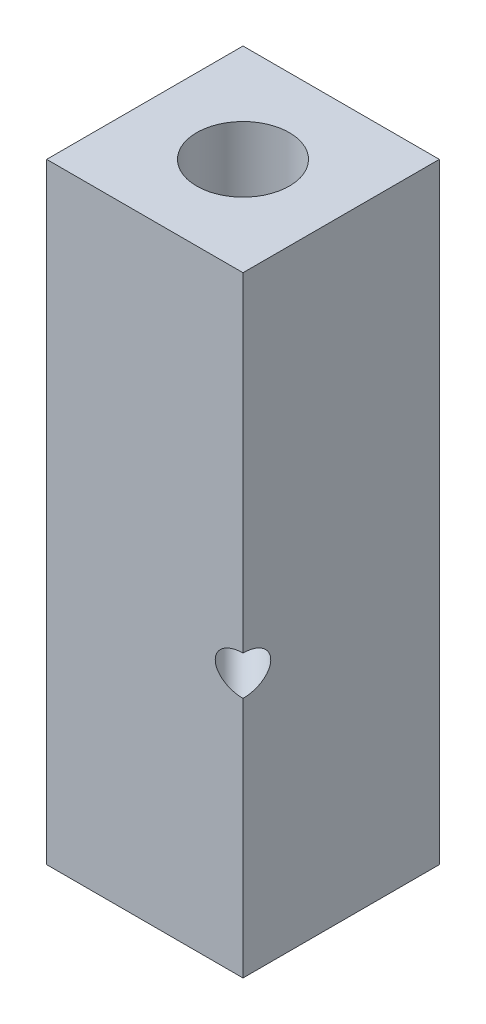
ISO-10303-21;
HEADER;
FILE_DESCRIPTION(('STEP AP214'),'2;1');
FILE_NAME('part.step','',(''),(''),'','','');
FILE_SCHEMA(('AUTOMOTIVE_DESIGN { 1 0 10303 214 1 1 1 1 }'));
ENDSEC;
DATA;
#1=APPLICATION_CONTEXT('core data for automotive mechanical design processes');
#2=APPLICATION_PROTOCOL_DEFINITION('international standard','automotive_design',2000,#1);
#3=PRODUCT_CONTEXT('',#1,'mechanical');
#4=PRODUCT('Part','Part','',(#3));
#5=PRODUCT_RELATED_PRODUCT_CATEGORY('part','',(#4));
#6=PRODUCT_DEFINITION_FORMATION('','',#4);
#7=PRODUCT_DEFINITION_CONTEXT('part definition',#1,'design');
#8=PRODUCT_DEFINITION('design','',#6,#7);
#9=PRODUCT_DEFINITION_SHAPE('','',#8);
#10=(LENGTH_UNIT() NAMED_UNIT(*) SI_UNIT(.MILLI.,.METRE.));
#11=(NAMED_UNIT(*) PLANE_ANGLE_UNIT() SI_UNIT($,.RADIAN.));
#12=(NAMED_UNIT(*) SI_UNIT($,.STERADIAN.) SOLID_ANGLE_UNIT());
#13=UNCERTAINTY_MEASURE_WITH_UNIT(LENGTH_MEASURE(1.E-05),#10,'distance_accuracy_value','');
#14=(GEOMETRIC_REPRESENTATION_CONTEXT(3) GLOBAL_UNCERTAINTY_ASSIGNED_CONTEXT((#13)) GLOBAL_UNIT_ASSIGNED_CONTEXT((#10,
#11,#12)) REPRESENTATION_CONTEXT('',''));
#15=CARTESIAN_POINT('',(0.,0.,0.));
#16=DIRECTION('',(0.,0.,1.));
#17=DIRECTION('',(1.,0.,0.));
#18=AXIS2_PLACEMENT_3D('',#15,#16,#17);
#19=CARTESIAN_POINT('',(0.,0.,0.));
#20=DIRECTION('',(0.,1.,0.));
#21=DIRECTION('',(0.,0.,1.));
#22=AXIS2_PLACEMENT_3D('',#19,#20,#21);
#23=PLANE('',#22);
#24=DIRECTION('',(0.,0.,1.));
#25=VECTOR('',#24,1.);
#26=CARTESIAN_POINT('',(-3.,0.,-3.));
#27=LINE('',#26,#25);
#28=CARTESIAN_POINT('',(-3.,0.,-3.));
#29=VERTEX_POINT('',#28);
#30=CARTESIAN_POINT('',(-3.,0.,3.));
#31=VERTEX_POINT('',#30);
#32=EDGE_CURVE('E221',#29,#31,#27,.T.);
#33=ORIENTED_EDGE('',*,*,#32,.T.);
#34=DIRECTION('',(1.,0.,0.));
#35=VECTOR('',#34,1.);
#36=CARTESIAN_POINT('',(-3.,0.,3.));
#37=LINE('',#36,#35);
#38=CARTESIAN_POINT('',(-0.5,0.,3.));
#39=VERTEX_POINT('',#38);
#40=EDGE_CURVE('E238',#31,#39,#37,.T.);
#41=ORIENTED_EDGE('',*,*,#40,.T.);
#42=DIRECTION('',(0.,0.,-1.));
#43=VECTOR('',#42,1.);
#44=CARTESIAN_POINT('',(-0.5,0.,-3.));
#45=LINE('',#44,#43);
#46=CARTESIAN_POINT('',(-0.5,0.,-3.));
#47=VERTEX_POINT('',#46);
#48=EDGE_CURVE('E241',#39,#47,#45,.T.);
#49=ORIENTED_EDGE('',*,*,#48,.T.);
#50=DIRECTION('',(-1.,0.,0.));
#51=VECTOR('',#50,1.);
#52=CARTESIAN_POINT('',(-3.,0.,-3.));
#53=LINE('',#52,#51);
#54=EDGE_CURVE('E226',#47,#29,#53,.T.);
#55=ORIENTED_EDGE('',*,*,#54,.T.);
#56=EDGE_LOOP('',(#33,#41,#49,#55));
#57=FACE_BOUND('',#56,.T.);
#58=DIRECTION('',(0.,0.,-1.));
#59=VECTOR('',#58,1.);
#60=CARTESIAN_POINT('',(4.5,0.,-4.5));
#61=LINE('',#60,#59);
#62=CARTESIAN_POINT('',(4.5,0.,4.5));
#63=VERTEX_POINT('',#62);
#64=CARTESIAN_POINT('',(4.5,0.,-4.5));
#65=VERTEX_POINT('',#64);
#66=EDGE_CURVE('E169',#63,#65,#61,.T.);
#67=ORIENTED_EDGE('',*,*,#66,.F.);
#68=DIRECTION('',(1.,0.,0.));
#69=VECTOR('',#68,1.);
#70=CARTESIAN_POINT('',(-4.5,0.,4.5));
#71=LINE('',#70,#69);
#72=CARTESIAN_POINT('',(-4.5,0.,4.5));
#73=VERTEX_POINT('',#72);
#74=EDGE_CURVE('E146',#73,#63,#71,.T.);
#75=ORIENTED_EDGE('',*,*,#74,.F.);
#76=DIRECTION('',(0.,0.,1.));
#77=VECTOR('',#76,1.);
#78=CARTESIAN_POINT('',(-4.5,0.,-4.5));
#79=LINE('',#78,#77);
#80=CARTESIAN_POINT('',(-4.5,0.,-4.5));
#81=VERTEX_POINT('',#80);
#82=EDGE_CURVE('E150',#81,#73,#79,.T.);
#83=ORIENTED_EDGE('',*,*,#82,.F.);
#84=DIRECTION('',(-1.,0.,0.));
#85=VECTOR('',#84,1.);
#86=CARTESIAN_POINT('',(-4.5,0.,-4.5));
#87=LINE('',#86,#85);
#88=EDGE_CURVE('E164',#65,#81,#87,.T.);
#89=ORIENTED_EDGE('',*,*,#88,.F.);
#90=EDGE_LOOP('',(#67,#75,#83,#89));
#91=FACE_BOUND('',#90,.T.);
#92=DIRECTION('',(0.,0.,1.));
#93=VECTOR('',#92,1.);
#94=CARTESIAN_POINT('',(0.5,0.,-3.));
#95=LINE('',#94,#93);
#96=CARTESIAN_POINT('',(0.5,0.,-3.));
#97=VERTEX_POINT('',#96);
#98=CARTESIAN_POINT('',(0.5,0.,3.));
#99=VERTEX_POINT('',#98);
#100=EDGE_CURVE('E192',#97,#99,#95,.T.);
#101=ORIENTED_EDGE('',*,*,#100,.T.);
#102=DIRECTION('',(1.,0.,0.));
#103=VECTOR('',#102,1.);
#104=CARTESIAN_POINT('',(0.5,0.,3.));
#105=LINE('',#104,#103);
#106=CARTESIAN_POINT('',(3.,0.,3.));
#107=VERTEX_POINT('',#106);
#108=EDGE_CURVE('E194',#99,#107,#105,.T.);
#109=ORIENTED_EDGE('',*,*,#108,.T.);
#110=DIRECTION('',(0.,0.,-1.));
#111=VECTOR('',#110,1.);
#112=CARTESIAN_POINT('',(3.,0.,-3.));
#113=LINE('',#112,#111);
#114=CARTESIAN_POINT('',(3.,0.,-3.));
#115=VERTEX_POINT('',#114);
#116=EDGE_CURVE('E203',#107,#115,#113,.T.);
#117=ORIENTED_EDGE('',*,*,#116,.T.);
#118=DIRECTION('',(-1.,0.,0.));
#119=VECTOR('',#118,1.);
#120=CARTESIAN_POINT('',(0.5,0.,-3.));
#121=LINE('',#120,#119);
#122=EDGE_CURVE('E196',#115,#97,#121,.T.);
#123=ORIENTED_EDGE('',*,*,#122,.T.);
#124=EDGE_LOOP('',(#101,#109,#117,#123));
#125=FACE_BOUND('',#124,.T.);
#126=ADVANCED_FACE('F34',(#57,#91,#125),#23,.F.);
#127=CARTESIAN_POINT('',(4.5,8.,-4.5));
#128=DIRECTION('',(-1.,0.,0.));
#129=DIRECTION('',(0.,0.,1.));
#130=AXIS2_PLACEMENT_3D('',#127,#128,#129);
#131=PLANE('',#130);
#132=DIRECTION('',(0.,-1.,0.));
#133=VECTOR('',#132,1.);
#134=CARTESIAN_POINT('',(4.5,8.,4.5));
#135=LINE('',#134,#133);
#136=CARTESIAN_POINT('',(4.5,28.,4.5));
#137=VERTEX_POINT('',#136);
#138=CARTESIAN_POINT('',(4.5,12.9,4.5));
#139=VERTEX_POINT('',#138);
#140=EDGE_CURVE('E140',#137,#139,#135,.T.);
#141=ORIENTED_EDGE('',*,*,#140,.T.);
#142=CARTESIAN_POINT('',(4.5,12.,4.5));
#143=DIRECTION('',(-1.,0.,0.));
#144=DIRECTION('',(0.,0.,1.));
#145=AXIS2_PLACEMENT_3D('',#142,#143,#144);
#146=ELLIPSE('',#145,1.27279220613578,0.899999999999998);
#147=CARTESIAN_POINT('',(4.5,11.1,4.5));
#148=VERTEX_POINT('',#147);
#149=EDGE_CURVE('E55',#139,#148,#146,.T.);
#150=ORIENTED_EDGE('',*,*,#149,.T.);
#151=EDGE_CURVE('E137',#148,#63,#135,.T.);
#152=ORIENTED_EDGE('',*,*,#151,.T.);
#153=ORIENTED_EDGE('',*,*,#66,.T.);
#154=DIRECTION('',(0.,-1.,0.));
#155=VECTOR('',#154,1.);
#156=CARTESIAN_POINT('',(4.5,8.,-4.5));
#157=LINE('',#156,#155);
#158=CARTESIAN_POINT('',(4.5,28.,-4.5));
#159=VERTEX_POINT('',#158);
#160=EDGE_CURVE('E42',#159,#65,#157,.T.);
#161=ORIENTED_EDGE('',*,*,#160,.F.);
#162=DIRECTION('',(0.,0.,-1.));
#163=VECTOR('',#162,1.);
#164=CARTESIAN_POINT('',(4.5,28.,4.5));
#165=LINE('',#164,#163);
#166=EDGE_CURVE('E444',#137,#159,#165,.T.);
#167=ORIENTED_EDGE('',*,*,#166,.F.);
#168=EDGE_LOOP('',(#141,#150,#152,#153,#161,#167));
#169=FACE_BOUND('',#168,.T.);
#170=ADVANCED_FACE('F36',(#169),#131,.F.);
#171=CARTESIAN_POINT('',(-4.5,8.,-4.5));
#172=DIRECTION('',(0.,0.,1.));
#173=DIRECTION('',(1.,0.,0.));
#174=AXIS2_PLACEMENT_3D('',#171,#172,#173);
#175=PLANE('',#174);
#176=DIRECTION('',(0.,-1.,0.));
#177=VECTOR('',#176,1.);
#178=CARTESIAN_POINT('',(-4.5,8.,-4.5));
#179=LINE('',#178,#177);
#180=CARTESIAN_POINT('',(-4.5,11.1,-4.5));
#181=VERTEX_POINT('',#180);
#182=EDGE_CURVE('E155',#181,#81,#179,.T.);
#183=ORIENTED_EDGE('',*,*,#182,.F.);
#184=CARTESIAN_POINT('',(-4.5,12.,-4.5));
#185=DIRECTION('',(0.,0.,1.));
#186=DIRECTION('',(1.,0.,0.));
#187=AXIS2_PLACEMENT_3D('',#184,#185,#186);
#188=ELLIPSE('',#187,1.27279220613578,0.899999999999998);
#189=CARTESIAN_POINT('',(-4.5,12.9,-4.5));
#190=VERTEX_POINT('',#189);
#191=EDGE_CURVE('E48',#181,#190,#188,.T.);
#192=ORIENTED_EDGE('',*,*,#191,.T.);
#193=CARTESIAN_POINT('',(-4.5,28.,-4.5));
#194=VERTEX_POINT('',#193);
#195=EDGE_CURVE('E156',#194,#190,#179,.T.);
#196=ORIENTED_EDGE('',*,*,#195,.F.);
#197=DIRECTION('',(-1.,0.,0.));
#198=VECTOR('',#197,1.);
#199=CARTESIAN_POINT('',(4.5,28.,-4.5));
#200=LINE('',#199,#198);
#201=EDGE_CURVE('E167',#159,#194,#200,.T.);
#202=ORIENTED_EDGE('',*,*,#201,.F.);
#203=ORIENTED_EDGE('',*,*,#160,.T.);
#204=ORIENTED_EDGE('',*,*,#88,.T.);
#205=EDGE_LOOP('',(#183,#192,#196,#202,#203,#204));
#206=FACE_BOUND('',#205,.T.);
#207=ADVANCED_FACE('F163',(#206),#175,.F.);
#208=CARTESIAN_POINT('',(-4.5,8.,-4.5));
#209=DIRECTION('',(1.,0.,0.));
#210=DIRECTION('',(0.,0.,-1.));
#211=AXIS2_PLACEMENT_3D('',#208,#209,#210);
#212=PLANE('',#211);
#213=ORIENTED_EDGE('',*,*,#195,.T.);
#214=CARTESIAN_POINT('',(-4.5,12.,-4.5));
#215=DIRECTION('',(1.,0.,0.));
#216=DIRECTION('',(0.,0.,1.));
#217=AXIS2_PLACEMENT_3D('',#214,#215,#216);
#218=ELLIPSE('',#217,1.27279220613578,0.899999999999998);
#219=EDGE_CURVE('E141',#190,#181,#218,.T.);
#220=ORIENTED_EDGE('',*,*,#219,.T.);
#221=ORIENTED_EDGE('',*,*,#182,.T.);
#222=ORIENTED_EDGE('',*,*,#82,.T.);
#223=DIRECTION('',(0.,-1.,0.));
#224=VECTOR('',#223,1.);
#225=CARTESIAN_POINT('',(-4.5,8.,4.5));
#226=LINE('',#225,#224);
#227=CARTESIAN_POINT('',(-4.5,28.,4.5));
#228=VERTEX_POINT('',#227);
#229=EDGE_CURVE('E149',#228,#73,#226,.T.);
#230=ORIENTED_EDGE('',*,*,#229,.F.);
#231=DIRECTION('',(0.,0.,1.));
#232=VECTOR('',#231,1.);
#233=CARTESIAN_POINT('',(-4.5,28.,-4.5));
#234=LINE('',#233,#232);
#235=EDGE_CURVE('E201',#194,#228,#234,.T.);
#236=ORIENTED_EDGE('',*,*,#235,.F.);
#237=EDGE_LOOP('',(#213,#220,#221,#222,#230,#236));
#238=FACE_BOUND('',#237,.T.);
#239=ADVANCED_FACE('F179',(#238),#212,.F.);
#240=CARTESIAN_POINT('',(-4.5,8.,4.5));
#241=DIRECTION('',(0.,0.,-1.));
#242=DIRECTION('',(-1.,0.,0.));
#243=AXIS2_PLACEMENT_3D('',#240,#241,#242);
#244=PLANE('',#243);
#245=ORIENTED_EDGE('',*,*,#151,.F.);
#246=CARTESIAN_POINT('',(4.5,12.,4.5));
#247=DIRECTION('',(0.,0.,-1.));
#248=DIRECTION('',(1.,0.,0.));
#249=AXIS2_PLACEMENT_3D('',#246,#247,#248);
#250=ELLIPSE('',#249,1.27279220613578,0.899999999999998);
#251=EDGE_CURVE('E12',#148,#139,#250,.T.);
#252=ORIENTED_EDGE('',*,*,#251,.T.);
#253=ORIENTED_EDGE('',*,*,#140,.F.);
#254=DIRECTION('',(1.,0.,0.));
#255=VECTOR('',#254,1.);
#256=CARTESIAN_POINT('',(-4.5,28.,4.5));
#257=LINE('',#256,#255);
#258=EDGE_CURVE('E184',#228,#137,#257,.T.);
#259=ORIENTED_EDGE('',*,*,#258,.F.);
#260=ORIENTED_EDGE('',*,*,#229,.T.);
#261=ORIENTED_EDGE('',*,*,#74,.T.);
#262=EDGE_LOOP('',(#245,#252,#253,#259,#260,#261));
#263=FACE_BOUND('',#262,.T.);
#264=ADVANCED_FACE('F143',(#263),#244,.F.);
#265=CARTESIAN_POINT('',(-3.,8.,-3.));
#266=DIRECTION('',(1.,0.,0.));
#267=DIRECTION('',(0.,0.,-1.));
#268=AXIS2_PLACEMENT_3D('',#265,#266,#267);
#269=PLANE('',#268);
#270=ORIENTED_EDGE('',*,*,#32,.F.);
#271=DIRECTION('',(0.,-1.,0.));
#272=VECTOR('',#271,1.);
#273=CARTESIAN_POINT('',(-3.,8.,-3.));
#274=LINE('',#273,#272);
#275=CARTESIAN_POINT('',(-3.,8.,-3.));
#276=VERTEX_POINT('',#275);
#277=EDGE_CURVE('E235',#276,#29,#274,.T.);
#278=ORIENTED_EDGE('',*,*,#277,.F.);
#279=DIRECTION('',(0.,0.,1.));
#280=VECTOR('',#279,1.);
#281=CARTESIAN_POINT('',(-3.,8.,-3.));
#282=LINE('',#281,#280);
#283=CARTESIAN_POINT('',(-3.,8.,3.));
#284=VERTEX_POINT('',#283);
#285=EDGE_CURVE('E222',#276,#284,#282,.T.);
#286=ORIENTED_EDGE('',*,*,#285,.T.);
#287=DIRECTION('',(0.,-1.,0.));
#288=VECTOR('',#287,1.);
#289=CARTESIAN_POINT('',(-3.,8.,3.));
#290=LINE('',#289,#288);
#291=EDGE_CURVE('E171',#284,#31,#290,.T.);
#292=ORIENTED_EDGE('',*,*,#291,.T.);
#293=EDGE_LOOP('',(#270,#278,#286,#292));
#294=FACE_BOUND('',#293,.T.);
#295=ADVANCED_FACE('F260',(#294),#269,.T.);
#296=CARTESIAN_POINT('',(-3.,8.,3.));
#297=DIRECTION('',(0.,0.,-1.));
#298=DIRECTION('',(-1.,0.,0.));
#299=AXIS2_PLACEMENT_3D('',#296,#297,#298);
#300=PLANE('',#299);
#301=ORIENTED_EDGE('',*,*,#40,.F.);
#302=ORIENTED_EDGE('',*,*,#291,.F.);
#303=DIRECTION('',(1.,0.,0.));
#304=VECTOR('',#303,1.);
#305=CARTESIAN_POINT('',(-3.,8.,3.));
#306=LINE('',#305,#304);
#307=CARTESIAN_POINT('',(-0.5,8.,3.));
#308=VERTEX_POINT('',#307);
#309=EDGE_CURVE('E225',#284,#308,#306,.T.);
#310=ORIENTED_EDGE('',*,*,#309,.T.);
#311=DIRECTION('',(0.,-1.,0.));
#312=VECTOR('',#311,1.);
#313=CARTESIAN_POINT('',(-0.5,8.,3.));
#314=LINE('',#313,#312);
#315=EDGE_CURVE('E175',#308,#39,#314,.T.);
#316=ORIENTED_EDGE('',*,*,#315,.T.);
#317=EDGE_LOOP('',(#301,#302,#310,#316));
#318=FACE_BOUND('',#317,.T.);
#319=ADVANCED_FACE('F252',(#318),#300,.T.);
#320=CARTESIAN_POINT('',(-0.5,8.,-3.));
#321=DIRECTION('',(-1.,0.,0.));
#322=DIRECTION('',(0.,0.,1.));
#323=AXIS2_PLACEMENT_3D('',#320,#321,#322);
#324=PLANE('',#323);
#325=ORIENTED_EDGE('',*,*,#48,.F.);
#326=ORIENTED_EDGE('',*,*,#315,.F.);
#327=DIRECTION('',(0.,0.,-1.));
#328=VECTOR('',#327,1.);
#329=CARTESIAN_POINT('',(-0.5,8.,-3.));
#330=LINE('',#329,#328);
#331=CARTESIAN_POINT('',(-0.5,8.,-3.));
#332=VERTEX_POINT('',#331);
#333=EDGE_CURVE('E229',#308,#332,#330,.T.);
#334=ORIENTED_EDGE('',*,*,#333,.T.);
#335=DIRECTION('',(0.,-1.,0.));
#336=VECTOR('',#335,1.);
#337=CARTESIAN_POINT('',(-0.5,8.,-3.));
#338=LINE('',#337,#336);
#339=EDGE_CURVE('E248',#332,#47,#338,.T.);
#340=ORIENTED_EDGE('',*,*,#339,.T.);
#341=EDGE_LOOP('',(#325,#326,#334,#340));
#342=FACE_BOUND('',#341,.T.);
#343=ADVANCED_FACE('F255',(#342),#324,.T.);
#344=CARTESIAN_POINT('',(-3.,8.,-3.));
#345=DIRECTION('',(0.,0.,1.));
#346=DIRECTION('',(1.,0.,0.));
#347=AXIS2_PLACEMENT_3D('',#344,#345,#346);
#348=PLANE('',#347);
#349=ORIENTED_EDGE('',*,*,#54,.F.);
#350=ORIENTED_EDGE('',*,*,#339,.F.);
#351=DIRECTION('',(-1.,0.,0.));
#352=VECTOR('',#351,1.);
#353=CARTESIAN_POINT('',(-3.,8.,-3.));
#354=LINE('',#353,#352);
#355=EDGE_CURVE('E232',#332,#276,#354,.T.);
#356=ORIENTED_EDGE('',*,*,#355,.T.);
#357=ORIENTED_EDGE('',*,*,#277,.T.);
#358=EDGE_LOOP('',(#349,#350,#356,#357));
#359=FACE_BOUND('',#358,.T.);
#360=ADVANCED_FACE('F262',(#359),#348,.T.);
#361=CARTESIAN_POINT('',(0.5,8.,-3.));
#362=DIRECTION('',(1.,0.,0.));
#363=DIRECTION('',(0.,0.,-1.));
#364=AXIS2_PLACEMENT_3D('',#361,#362,#363);
#365=PLANE('',#364);
#366=ORIENTED_EDGE('',*,*,#100,.F.);
#367=DIRECTION('',(0.,-1.,0.));
#368=VECTOR('',#367,1.);
#369=CARTESIAN_POINT('',(0.5,8.,-3.));
#370=LINE('',#369,#368);
#371=CARTESIAN_POINT('',(0.5,8.,-3.));
#372=VERTEX_POINT('',#371);
#373=EDGE_CURVE('E213',#372,#97,#370,.T.);
#374=ORIENTED_EDGE('',*,*,#373,.F.);
#375=DIRECTION('',(0.,0.,1.));
#376=VECTOR('',#375,1.);
#377=CARTESIAN_POINT('',(0.5,8.,-3.));
#378=LINE('',#377,#376);
#379=CARTESIAN_POINT('',(0.5,8.,3.));
#380=VERTEX_POINT('',#379);
#381=EDGE_CURVE('E212',#372,#380,#378,.T.);
#382=ORIENTED_EDGE('',*,*,#381,.T.);
#383=DIRECTION('',(0.,-1.,0.));
#384=VECTOR('',#383,1.);
#385=CARTESIAN_POINT('',(0.5,8.,3.));
#386=LINE('',#385,#384);
#387=EDGE_CURVE('E219',#380,#99,#386,.T.);
#388=ORIENTED_EDGE('',*,*,#387,.T.);
#389=EDGE_LOOP('',(#366,#374,#382,#388));
#390=FACE_BOUND('',#389,.T.);
#391=ADVANCED_FACE('F290',(#390),#365,.T.);
#392=CARTESIAN_POINT('',(0.5,8.,3.));
#393=DIRECTION('',(0.,0.,-1.));
#394=DIRECTION('',(-1.,0.,0.));
#395=AXIS2_PLACEMENT_3D('',#392,#393,#394);
#396=PLANE('',#395);
#397=ORIENTED_EDGE('',*,*,#108,.F.);
#398=ORIENTED_EDGE('',*,*,#387,.F.);
#399=DIRECTION('',(1.,0.,0.));
#400=VECTOR('',#399,1.);
#401=CARTESIAN_POINT('',(0.5,8.,3.));
#402=LINE('',#401,#400);
#403=CARTESIAN_POINT('',(3.,8.,3.));
#404=VERTEX_POINT('',#403);
#405=EDGE_CURVE('E455',#380,#404,#402,.T.);
#406=ORIENTED_EDGE('',*,*,#405,.T.);
#407=DIRECTION('',(0.,-1.,0.));
#408=VECTOR('',#407,1.);
#409=CARTESIAN_POINT('',(3.,8.,3.));
#410=LINE('',#409,#408);
#411=EDGE_CURVE('E217',#404,#107,#410,.T.);
#412=ORIENTED_EDGE('',*,*,#411,.T.);
#413=EDGE_LOOP('',(#397,#398,#406,#412));
#414=FACE_BOUND('',#413,.T.);
#415=ADVANCED_FACE('F286',(#414),#396,.T.);
#416=CARTESIAN_POINT('',(3.,8.,-3.));
#417=DIRECTION('',(-1.,0.,0.));
#418=DIRECTION('',(0.,0.,1.));
#419=AXIS2_PLACEMENT_3D('',#416,#417,#418);
#420=PLANE('',#419);
#421=ORIENTED_EDGE('',*,*,#116,.F.);
#422=ORIENTED_EDGE('',*,*,#411,.F.);
#423=DIRECTION('',(0.,0.,-1.));
#424=VECTOR('',#423,1.);
#425=CARTESIAN_POINT('',(3.,8.,-3.));
#426=LINE('',#425,#424);
#427=CARTESIAN_POINT('',(3.,8.,-3.));
#428=VERTEX_POINT('',#427);
#429=EDGE_CURVE('E457',#404,#428,#426,.T.);
#430=ORIENTED_EDGE('',*,*,#429,.T.);
#431=DIRECTION('',(0.,-1.,0.));
#432=VECTOR('',#431,1.);
#433=CARTESIAN_POINT('',(3.,8.,-3.));
#434=LINE('',#433,#432);
#435=EDGE_CURVE('E215',#428,#115,#434,.T.);
#436=ORIENTED_EDGE('',*,*,#435,.T.);
#437=EDGE_LOOP('',(#421,#422,#430,#436));
#438=FACE_BOUND('',#437,.T.);
#439=ADVANCED_FACE('F282',(#438),#420,.T.);
#440=CARTESIAN_POINT('',(0.5,8.,-3.));
#441=DIRECTION('',(0.,0.,1.));
#442=DIRECTION('',(1.,0.,0.));
#443=AXIS2_PLACEMENT_3D('',#440,#441,#442);
#444=PLANE('',#443);
#445=ORIENTED_EDGE('',*,*,#122,.F.);
#446=ORIENTED_EDGE('',*,*,#435,.F.);
#447=DIRECTION('',(-1.,0.,0.));
#448=VECTOR('',#447,1.);
#449=CARTESIAN_POINT('',(0.5,8.,-3.));
#450=LINE('',#449,#448);
#451=EDGE_CURVE('E207',#428,#372,#450,.T.);
#452=ORIENTED_EDGE('',*,*,#451,.T.);
#453=ORIENTED_EDGE('',*,*,#373,.T.);
#454=EDGE_LOOP('',(#445,#446,#452,#453));
#455=FACE_BOUND('',#454,.T.);
#456=ADVANCED_FACE('F276',(#455),#444,.T.);
#457=CARTESIAN_POINT('',(0.,8.,0.));
#458=DIRECTION('',(0.,1.,0.));
#459=DIRECTION('',(0.,0.,1.));
#460=AXIS2_PLACEMENT_3D('',#457,#458,#459);
#461=PLANE('',#460);
#462=ORIENTED_EDGE('',*,*,#381,.F.);
#463=ORIENTED_EDGE('',*,*,#451,.F.);
#464=ORIENTED_EDGE('',*,*,#429,.F.);
#465=ORIENTED_EDGE('',*,*,#405,.F.);
#466=EDGE_LOOP('',(#462,#463,#464,#465));
#467=FACE_BOUND('',#466,.T.);
#468=ADVANCED_FACE('F267',(#467),#461,.F.);
#469=ORIENTED_EDGE('',*,*,#285,.F.);
#470=ORIENTED_EDGE('',*,*,#355,.F.);
#471=ORIENTED_EDGE('',*,*,#333,.F.);
#472=ORIENTED_EDGE('',*,*,#309,.F.);
#473=EDGE_LOOP('',(#469,#470,#471,#472));
#474=FACE_BOUND('',#473,.T.);
#475=ADVANCED_FACE('F264',(#474),#461,.F.);
#476=CARTESIAN_POINT('',(0.,28.,0.));
#477=DIRECTION('',(0.,1.,0.));
#478=DIRECTION('',(0.,0.,1.));
#479=AXIS2_PLACEMENT_3D('',#476,#477,#478);
#480=PLANE('',#479);
#481=CARTESIAN_POINT('',(0.,28.,0.));
#482=DIRECTION('',(0.,1.,0.));
#483=DIRECTION('',(0.,0.,1.));
#484=AXIS2_PLACEMENT_3D('',#481,#482,#483);
#485=CIRCLE('',#484,2.125);
#486=CARTESIAN_POINT('',(0.,28.,2.125));
#487=VERTEX_POINT('',#486);
#488=EDGE_CURVE('E442',#487,#487,#485,.T.);
#489=ORIENTED_EDGE('',*,*,#488,.F.);
#490=EDGE_LOOP('',(#489));
#491=FACE_BOUND('',#490,.T.);
#492=ORIENTED_EDGE('',*,*,#258,.T.);
#493=ORIENTED_EDGE('',*,*,#166,.T.);
#494=ORIENTED_EDGE('',*,*,#201,.T.);
#495=ORIENTED_EDGE('',*,*,#235,.T.);
#496=EDGE_LOOP('',(#492,#493,#494,#495));
#497=FACE_BOUND('',#496,.T.);
#498=ADVANCED_FACE('F266',(#491,#497),#480,.T.);
#499=CARTESIAN_POINT('',(0.,15.,0.));
#500=DIRECTION('',(0.,1.,0.));
#501=DIRECTION('',(0.,0.,1.));
#502=AXIS2_PLACEMENT_3D('',#499,#500,#501);
#503=CYLINDRICAL_SURFACE('',#502,2.125);
#504=CARTESIAN_POINT('',(0.,15.,0.));
#505=DIRECTION('',(0.,1.,0.));
#506=DIRECTION('',(0.,0.,1.));
#507=AXIS2_PLACEMENT_3D('',#504,#505,#506);
#508=CIRCLE('',#507,2.125);
#509=CARTESIAN_POINT('',(0.,15.,2.125));
#510=VERTEX_POINT('',#509);
#511=EDGE_CURVE('E441',#510,#510,#508,.T.);
#512=CARTESIAN_POINT('',(0.,15.,2.125));
#513=CARTESIAN_POINT('',(0.,15.1354166666667,2.125));
#514=CARTESIAN_POINT('',(0.,15.2708333333333,2.125));
#515=CARTESIAN_POINT('',(0.,15.5416666666667,2.125));
#516=CARTESIAN_POINT('',(0.,15.6770833333333,2.125));
#517=CARTESIAN_POINT('',(0.,15.9479166666667,2.125));
#518=CARTESIAN_POINT('',(0.,16.0833333333333,2.125));
#519=CARTESIAN_POINT('',(0.,16.3541666666667,2.125));
#520=CARTESIAN_POINT('',(0.,16.4895833333333,2.125));
#521=CARTESIAN_POINT('',(0.,16.7604166666667,2.125));
#522=CARTESIAN_POINT('',(0.,16.8958333333333,2.125));
#523=CARTESIAN_POINT('',(0.,17.1666666666667,2.125));
#524=CARTESIAN_POINT('',(0.,17.3020833333333,2.125));
#525=CARTESIAN_POINT('',(0.,17.5729166666667,2.125));
#526=CARTESIAN_POINT('',(0.,17.7083333333333,2.125));
#527=CARTESIAN_POINT('',(0.,17.9791666666667,2.125));
#528=CARTESIAN_POINT('',(0.,18.1145833333333,2.125));
#529=CARTESIAN_POINT('',(0.,18.3854166666667,2.125));
#530=CARTESIAN_POINT('',(0.,18.5208333333333,2.125));
#531=CARTESIAN_POINT('',(0.,18.7916666666667,2.125));
#532=CARTESIAN_POINT('',(0.,18.9270833333333,2.125));
#533=CARTESIAN_POINT('',(0.,19.1979166666667,2.125));
#534=CARTESIAN_POINT('',(0.,19.3333333333333,2.125));
#535=CARTESIAN_POINT('',(0.,19.6041666666667,2.125));
#536=CARTESIAN_POINT('',(0.,19.7395833333333,2.125));
#537=CARTESIAN_POINT('',(0.,20.0104166666667,2.125));
#538=CARTESIAN_POINT('',(0.,20.1458333333333,2.125));
#539=CARTESIAN_POINT('',(0.,20.4166666666667,2.125));
#540=CARTESIAN_POINT('',(0.,20.5520833333333,2.125));
#541=CARTESIAN_POINT('',(0.,20.8229166666667,2.125));
#542=CARTESIAN_POINT('',(0.,20.9583333333333,2.125));
#543=CARTESIAN_POINT('',(0.,21.2291666666667,2.125));
#544=CARTESIAN_POINT('',(0.,21.3645833333333,2.125));
#545=CARTESIAN_POINT('',(0.,21.6354166666667,2.125));
#546=CARTESIAN_POINT('',(0.,21.7708333333333,2.125));
#547=CARTESIAN_POINT('',(0.,22.0416666666667,2.125));
#548=CARTESIAN_POINT('',(0.,22.1770833333333,2.125));
#549=CARTESIAN_POINT('',(0.,22.4479166666667,2.125));
#550=CARTESIAN_POINT('',(0.,22.5833333333333,2.125));
#551=CARTESIAN_POINT('',(0.,22.8541666666667,2.125));
#552=CARTESIAN_POINT('',(0.,22.9895833333333,2.125));
#553=CARTESIAN_POINT('',(0.,23.2604166666667,2.125));
#554=CARTESIAN_POINT('',(0.,23.3958333333333,2.125));
#555=CARTESIAN_POINT('',(0.,23.6666666666667,2.125));
#556=CARTESIAN_POINT('',(0.,23.8020833333333,2.125));
#557=CARTESIAN_POINT('',(0.,24.0729166666667,2.125));
#558=CARTESIAN_POINT('',(0.,24.2083333333333,2.125));
#559=CARTESIAN_POINT('',(0.,24.4791666666667,2.125));
#560=CARTESIAN_POINT('',(0.,24.6145833333333,2.125));
#561=CARTESIAN_POINT('',(0.,24.8854166666667,2.125));
#562=CARTESIAN_POINT('',(0.,25.0208333333333,2.125));
#563=CARTESIAN_POINT('',(0.,25.2916666666667,2.125));
#564=CARTESIAN_POINT('',(0.,25.4270833333333,2.125));
#565=CARTESIAN_POINT('',(0.,25.6979166666667,2.125));
#566=CARTESIAN_POINT('',(0.,25.8333333333333,2.125));
#567=CARTESIAN_POINT('',(0.,26.1041666666667,2.125));
#568=CARTESIAN_POINT('',(0.,26.2395833333333,2.125));
#569=CARTESIAN_POINT('',(0.,26.5104166666667,2.125));
#570=CARTESIAN_POINT('',(0.,26.6458333333333,2.125));
#571=CARTESIAN_POINT('',(0.,26.9166666666667,2.125));
#572=CARTESIAN_POINT('',(0.,27.0520833333333,2.125));
#573=CARTESIAN_POINT('',(0.,27.3229166666667,2.125));
#574=CARTESIAN_POINT('',(0.,27.4583333333333,2.125));
#575=CARTESIAN_POINT('',(0.,27.7291666666667,2.125));
#576=CARTESIAN_POINT('',(0.,27.8645833333333,2.125));
#577=CARTESIAN_POINT('',(0.,28.,2.125));
#578=B_SPLINE_CURVE_WITH_KNOTS('',3,(#512,#513,#514,#515,#516,#517,#518,#519,#520,#521,#522,
#523,#524,#525,#526,#527,#528,#529,#530,#531,#532,#533,#534,#535,#536,#537,#538,#539,#540,#541,
#542,#543,#544,#545,#546,#547,#548,#549,#550,#551,#552,#553,#554,#555,#556,#557,#558,#559,#560,
#561,#562,#563,#564,#565,#566,#567,#568,#569,#570,#571,#572,#573,#574,#575,#576,#577),
.UNSPECIFIED.,.F.,.F.,(4,2,2,2,2,2,2,2,2,2,2,2,2,2,2,2,2,2,2,2,2,2,2,2,2,2,2,2,2,2,2,2,4),(0.,
0.406249999999999,0.812499999999999,1.21875,1.625,2.03125,2.4375,2.84375,3.25,3.65625,4.0625,
4.46875,4.875,5.28125,5.6875,6.09375,6.5,6.90625,7.3125,7.71875,8.125,8.53125,8.9375,9.34375,
9.75,10.15625,10.5625,10.96875,11.375,11.78125,12.1875,12.59375,13.),.UNSPECIFIED.);
#579=EDGE_CURVE('BSEAM273',#510,#487,#578,.T.);
#580=ORIENTED_EDGE('',*,*,#511,.F.);
#581=ORIENTED_EDGE('',*,*,#488,.T.);
#582=ORIENTED_EDGE('',*,*,#579,.T.);
#583=ORIENTED_EDGE('',*,*,#579,.F.);
#584=EDGE_LOOP('',(#580,#582,#581,#583));
#585=FACE_BOUND('',#584,.T.);
#586=ADVANCED_FACE('F273',(#585),#503,.F.);
#587=CARTESIAN_POINT('',(0.,15.,0.));
#588=DIRECTION('',(0.,1.,0.));
#589=DIRECTION('',(0.,0.,1.));
#590=AXIS2_PLACEMENT_3D('',#587,#588,#589);
#591=PLANE('',#590);
#592=ORIENTED_EDGE('',*,*,#511,.T.);
#593=EDGE_LOOP('',(#592));
#594=FACE_BOUND('',#593,.T.);
#595=ADVANCED_FACE('F391',(#594),#591,.T.);
#596=CARTESIAN_POINT('',(0.,12.,0.));
#597=DIRECTION('',(0.707106781186547,0.,0.707106781186548));
#598=DIRECTION('',(0.707106781186548,0.,-0.707106781186547));
#599=AXIS2_PLACEMENT_3D('',#596,#597,#598);
#600=CYLINDRICAL_SURFACE('',#599,0.899999999999998);
#601=ORIENTED_EDGE('',*,*,#251,.F.);
#602=ORIENTED_EDGE('',*,*,#149,.F.);
#603=EDGE_LOOP('',(#601,#602));
#604=FACE_BOUND('',#603,.T.);
#605=ORIENTED_EDGE('',*,*,#219,.F.);
#606=ORIENTED_EDGE('',*,*,#191,.F.);
#607=EDGE_LOOP('',(#605,#606));
#608=FACE_BOUND('',#607,.T.);
#609=ADVANCED_FACE('F131',(#604,#608),#600,.F.);
#610=CLOSED_SHELL('',(#126,#170,#207,#239,#264,#295,#319,#343,#360,#391,#415,#439,#456,#468,
#475,#498,#586,#595,#609));
#611=MANIFOLD_SOLID_BREP('B2',#610);
#612=ADVANCED_BREP_SHAPE_REPRESENTATION('',(#18,#611),#14);
#613=SHAPE_DEFINITION_REPRESENTATION(#9,#612);
ENDSEC;
END-ISO-10303-21;
